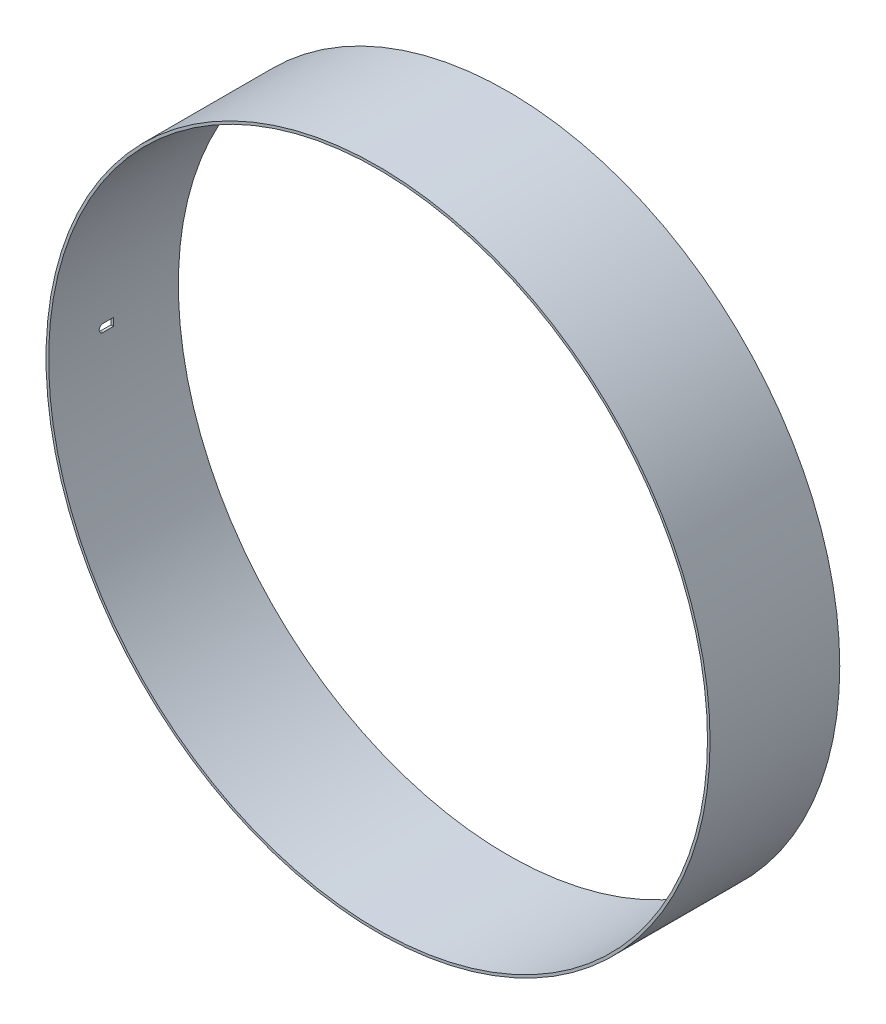
ISO-10303-21;
HEADER;
FILE_DESCRIPTION(('STEP AP214'),'2;1');
FILE_NAME('part.step','',(''),(''),'','','');
FILE_SCHEMA(('AUTOMOTIVE_DESIGN { 1 0 10303 214 1 1 1 1 }'));
ENDSEC;
DATA;
#1=APPLICATION_CONTEXT('core data for automotive mechanical design processes');
#2=APPLICATION_PROTOCOL_DEFINITION('international standard','automotive_design',2000,#1);
#3=PRODUCT_CONTEXT('',#1,'mechanical');
#4=PRODUCT('Part','Part','',(#3));
#5=PRODUCT_RELATED_PRODUCT_CATEGORY('part','',(#4));
#6=PRODUCT_DEFINITION_FORMATION('','',#4);
#7=PRODUCT_DEFINITION_CONTEXT('part definition',#1,'design');
#8=PRODUCT_DEFINITION('design','',#6,#7);
#9=PRODUCT_DEFINITION_SHAPE('','',#8);
#10=(LENGTH_UNIT() NAMED_UNIT(*) SI_UNIT(.MILLI.,.METRE.));
#11=(NAMED_UNIT(*) PLANE_ANGLE_UNIT() SI_UNIT($,.RADIAN.));
#12=(NAMED_UNIT(*) SI_UNIT($,.STERADIAN.) SOLID_ANGLE_UNIT());
#13=UNCERTAINTY_MEASURE_WITH_UNIT(LENGTH_MEASURE(1.E-05),#10,'distance_accuracy_value','');
#14=(GEOMETRIC_REPRESENTATION_CONTEXT(3) GLOBAL_UNCERTAINTY_ASSIGNED_CONTEXT((#13)) GLOBAL_UNIT_ASSIGNED_CONTEXT((#10,
#11,#12)) REPRESENTATION_CONTEXT('',''));
#15=CARTESIAN_POINT('',(0.,0.,0.));
#16=DIRECTION('',(0.,0.,1.));
#17=DIRECTION('',(1.,0.,0.));
#18=AXIS2_PLACEMENT_3D('',#15,#16,#17);
#19=CARTESIAN_POINT('',(0.,0.,25.));
#20=DIRECTION('',(0.,0.,1.));
#21=DIRECTION('',(1.,0.,0.));
#22=AXIS2_PLACEMENT_3D('',#19,#20,#21);
#23=PLANE('',#22);
#24=CARTESIAN_POINT('',(0.,0.,25.));
#25=DIRECTION('',(0.,0.,1.));
#26=DIRECTION('',(1.,0.,0.));
#27=AXIS2_PLACEMENT_3D('',#24,#25,#26);
#28=CIRCLE('',#27,64.);
#29=CARTESIAN_POINT('',(64.,0.,25.));
#30=VERTEX_POINT('',#29);
#31=EDGE_CURVE('E137',#30,#30,#28,.T.);
#32=ORIENTED_EDGE('',*,*,#31,.T.);
#33=EDGE_LOOP('',(#32));
#34=FACE_BOUND('',#33,.T.);
#35=CARTESIAN_POINT('',(0.,0.,25.));
#36=DIRECTION('',(0.,0.,1.));
#37=DIRECTION('',(1.,0.,0.));
#38=AXIS2_PLACEMENT_3D('',#35,#36,#37);
#39=CIRCLE('',#38,63.5);
#40=CARTESIAN_POINT('',(63.5,0.,25.));
#41=VERTEX_POINT('',#40);
#42=EDGE_CURVE('E102',#41,#41,#39,.T.);
#43=ORIENTED_EDGE('',*,*,#42,.F.);
#44=EDGE_LOOP('',(#43));
#45=FACE_BOUND('',#44,.T.);
#46=ADVANCED_FACE('F36',(#34,#45),#23,.T.);
#47=CARTESIAN_POINT('',(0.,0.,0.));
#48=DIRECTION('',(0.,0.,1.));
#49=DIRECTION('',(1.,0.,0.));
#50=AXIS2_PLACEMENT_3D('',#47,#48,#49);
#51=PLANE('',#50);
#52=CARTESIAN_POINT('',(0.,0.,0.));
#53=DIRECTION('',(0.,0.,1.));
#54=DIRECTION('',(1.,0.,0.));
#55=AXIS2_PLACEMENT_3D('',#52,#53,#54);
#56=CIRCLE('',#55,64.);
#57=CARTESIAN_POINT('',(64.,0.,0.));
#58=VERTEX_POINT('',#57);
#59=EDGE_CURVE('E133',#58,#58,#56,.T.);
#60=ORIENTED_EDGE('',*,*,#59,.F.);
#61=EDGE_LOOP('',(#60));
#62=FACE_BOUND('',#61,.T.);
#63=CARTESIAN_POINT('',(0.,0.,0.));
#64=DIRECTION('',(0.,0.,1.));
#65=DIRECTION('',(1.,0.,0.));
#66=AXIS2_PLACEMENT_3D('',#63,#64,#65);
#67=CIRCLE('',#66,63.5);
#68=CARTESIAN_POINT('',(63.5,0.,0.));
#69=VERTEX_POINT('',#68);
#70=EDGE_CURVE('E99',#69,#69,#67,.T.);
#71=ORIENTED_EDGE('',*,*,#70,.T.);
#72=EDGE_LOOP('',(#71));
#73=FACE_BOUND('',#72,.T.);
#74=ADVANCED_FACE('F123',(#62,#73),#51,.F.);
#75=CARTESIAN_POINT('',(0.,0.,25.));
#76=DIRECTION('',(0.,0.,-1.));
#77=DIRECTION('',(-1.,0.,0.));
#78=AXIS2_PLACEMENT_3D('',#75,#76,#77);
#79=CYLINDRICAL_SURFACE('',#78,64.);
#80=DIRECTION('',(0.,0.,-1.));
#81=VECTOR('',#80,1.);
#82=CARTESIAN_POINT('',(-63.9956053178654,0.749999999999997,25.));
#83=LINE('',#82,#81);
#84=CARTESIAN_POINT('',(-63.9956053178654,0.749999999999999,12.5));
#85=VERTEX_POINT('',#84);
#86=CARTESIAN_POINT('',(-63.9956053178654,0.749999999999999,14.5));
#87=VERTEX_POINT('',#86);
#88=EDGE_CURVE('E98',#85,#87,#83,.F.);
#89=ORIENTED_EDGE('',*,*,#88,.T.);
#90=CARTESIAN_POINT('',(-63.9956053178654,0.749999999999999,14.5));
#91=CARTESIAN_POINT('',(-63.9956037098696,0.750035835942117,14.5421910770075));
#92=CARTESIAN_POINT('',(-63.9956469970787,0.746441968559594,14.5843714215498));
#93=CARTESIAN_POINT('',(-63.9958114826796,0.732258948323395,14.6675087499764));
#94=CARTESIAN_POINT('',(-63.9959326238419,0.721674933697341,14.7084666093731));
#95=CARTESIAN_POINT('',(-63.9962410418769,0.693768570284752,14.788040884003));
#96=CARTESIAN_POINT('',(-63.996428349344,0.676443103974629,14.8266562063873));
#97=CARTESIAN_POINT('',(-63.9968474288403,0.635561316466206,14.9004231573654));
#98=CARTESIAN_POINT('',(-63.9970791921771,0.612006213004127,14.9355754610504));
#99=CARTESIAN_POINT('',(-63.9975612337378,0.559327317799181,15.0014292132468));
#100=CARTESIAN_POINT('',(-63.9978115131609,0.530203165186916,15.0321303731013));
#101=CARTESIAN_POINT('',(-63.9983023641379,0.467209642594577,15.088212293629));
#102=CARTESIAN_POINT('',(-63.9985429342075,0.43333955065406,15.1135922433615));
#103=CARTESIAN_POINT('',(-63.9989872076672,0.361819288781405,15.1583049301819));
#104=CARTESIAN_POINT('',(-63.9991909116235,0.324169176929307,15.1776377601651));
#105=CARTESIAN_POINT('',(-63.9995384760734,0.246159794660724,15.2097067767733));
#106=CARTESIAN_POINT('',(-63.999682340412,0.205800698501665,15.2224433872466));
#107=CARTESIAN_POINT('',(-63.9998940231178,0.123517926763101,15.2409599211599));
#108=CARTESIAN_POINT('',(-63.9999618434687,0.0815942920255288,15.2467400260672));
#109=CARTESIAN_POINT('',(-64.0000137992556,-0.00262935043937894,15.2511800445644));
#110=CARTESIAN_POINT('',(-63.9999979327951,-0.0449293666746839,15.249839796791));
#111=CARTESIAN_POINT('',(-63.999884302904,-0.128701411472135,15.240077097833));
#112=CARTESIAN_POINT('',(-63.9997865443094,-0.17017348877856,15.2316550648495));
#113=CARTESIAN_POINT('',(-63.9995201572991,-0.251114901443764,15.2079685291027));
#114=CARTESIAN_POINT('',(-63.9993515290966,-0.290584242826735,15.1927040469227));
#115=CARTESIAN_POINT('',(-63.9989624013025,-0.366402039513268,15.1557650942976));
#116=CARTESIAN_POINT('',(-63.9987418990573,-0.402750335032307,15.1340902959234));
#117=CARTESIAN_POINT('',(-63.9982738968681,-0.471290475760222,15.0849473003297));
#118=CARTESIAN_POINT('',(-63.9980263982414,-0.503482523632332,15.0574793857612));
#119=CARTESIAN_POINT('',(-63.9975323102206,-0.562796477535366,14.997532032022));
#120=CARTESIAN_POINT('',(-63.9972857207604,-0.589918759154415,14.9650529644228));
#121=CARTESIAN_POINT('',(-63.9968211526899,-0.638334337428008,14.8959896190705));
#122=CARTESIAN_POINT('',(-63.9966031831936,-0.659625779586504,14.8594040404471));
#123=CARTESIAN_POINT('',(-63.9962204079976,-0.695774218932545,14.7831617899206));
#124=CARTESIAN_POINT('',(-63.9960556347582,-0.710627289322739,14.7435032611389));
#125=CARTESIAN_POINT('',(-63.9957982663388,-0.733441606037515,14.6622861412113));
#126=CARTESIAN_POINT('',(-63.9957055609467,-0.741413377877501,14.6207305546609));
#127=CARTESIAN_POINT('',(-63.9956377315346,-0.747229465587877,14.565748912583));
#128=CARTESIAN_POINT('',(-63.9956255825901,-0.748268964520423,14.5526090631731));
#129=CARTESIAN_POINT('',(-63.9956093866077,-0.749653283235331,14.5263145831028));
#130=CARTESIAN_POINT('',(-63.995605326207,-0.749999248782374,14.5131600128046));
#131=CARTESIAN_POINT('',(-63.9956053178654,-0.750000000000001,14.5));
#132=B_SPLINE_CURVE_WITH_KNOTS('',3,(#90,#91,#92,#93,#94,#95,#96,#97,#98,#99,#100,#101,#102,
#103,#104,#105,#106,#107,#108,#109,#110,#111,#112,#113,#114,#115,#116,#117,#118,#119,#120,#121,
#122,#123,#124,#125,#126,#127,#128,#129,#130,#131),.UNSPECIFIED.,.F.,.F.,(4,2,2,2,2,2,2,2,2,2,2,
2,2,2,2,2,2,2,2,2,4),(0.,0.126405040814938,0.252717268697454,0.379087978085643,
0.505434003436502,0.631788218672794,0.758161676038905,0.884533191972769,1.010896586741,
1.13725668512515,1.2636196471274,1.38997514753461,1.5163302678443,1.64269185315666,
1.76904727460939,1.89539333144472,2.02177952604463,2.14824269617108,2.27451208590352,
2.31404205419671,2.3535066622743),.UNSPECIFIED.);
#133=CARTESIAN_POINT('',(-63.9956053178654,-0.750000000000001,14.5));
#134=VERTEX_POINT('',#133);
#135=EDGE_CURVE('E91',#87,#134,#132,.T.);
#136=ORIENTED_EDGE('',*,*,#135,.T.);
#137=DIRECTION('',(0.,0.,-1.));
#138=VECTOR('',#137,1.);
#139=CARTESIAN_POINT('',(-63.9956053178654,-0.750000000000001,25.));
#140=LINE('',#139,#138);
#141=CARTESIAN_POINT('',(-63.9956053178654,-0.750000000000001,12.5));
#142=VERTEX_POINT('',#141);
#143=EDGE_CURVE('E80',#134,#142,#140,.T.);
#144=ORIENTED_EDGE('',*,*,#143,.T.);
#145=CARTESIAN_POINT('',(0.,0.,12.5));
#146=DIRECTION('',(0.,0.,-1.));
#147=DIRECTION('',(-1.,0.,0.));
#148=AXIS2_PLACEMENT_3D('',#145,#146,#147);
#149=CIRCLE('',#148,64.);
#150=EDGE_CURVE('E85',#142,#85,#149,.T.);
#151=ORIENTED_EDGE('',*,*,#150,.T.);
#152=EDGE_LOOP('',(#89,#136,#144,#151));
#153=FACE_BOUND('',#152,.T.);
#154=ORIENTED_EDGE('',*,*,#31,.F.);
#155=EDGE_LOOP('',(#154));
#156=FACE_BOUND('',#155,.T.);
#157=ORIENTED_EDGE('',*,*,#59,.T.);
#158=EDGE_LOOP('',(#157));
#159=FACE_BOUND('',#158,.T.);
#160=ADVANCED_FACE('F38',(#153,#156,#159),#79,.T.);
#161=CARTESIAN_POINT('',(0.,0.,25.));
#162=DIRECTION('',(0.,0.,-1.));
#163=DIRECTION('',(-1.,0.,0.));
#164=AXIS2_PLACEMENT_3D('',#161,#162,#163);
#165=CYLINDRICAL_SURFACE('',#164,63.5);
#166=CARTESIAN_POINT('',(-63.4955707116646,0.749999999999999,14.5));
#167=CARTESIAN_POINT('',(-63.4955690910058,0.750035836051837,14.5421910528964));
#168=CARTESIAN_POINT('',(-63.4956127190584,0.746441972648091,14.5843713728113));
#169=CARTESIAN_POINT('',(-63.4957784997986,0.732258969571632,14.6675086499747));
#170=CARTESIAN_POINT('',(-63.4959005948023,0.72167496843853,14.70846648279));
#171=CARTESIAN_POINT('',(-63.4962114412277,0.693768642903057,14.7880407045254));
#172=CARTESIAN_POINT('',(-63.4964002234832,0.676443201109353,14.8266560006418));
#173=CARTESIAN_POINT('',(-63.4968226026323,0.635561473481933,14.9004229044998));
#174=CARTESIAN_POINT('',(-63.4970561907656,0.612006405279076,14.9355751872745));
#175=CARTESIAN_POINT('',(-63.4975420278759,0.559327571612713,15.0014289293752));
#176=CARTESIAN_POINT('',(-63.497794278074,0.530203441516458,15.0321300970341));
#177=CARTESIAN_POINT('',(-63.4982889942095,0.467209962645887,15.0882120387531));
#178=CARTESIAN_POINT('',(-63.498531458651,0.433339891911354,15.1135920018738));
#179=CARTESIAN_POINT('',(-63.4989792307359,0.361819651276852,15.1583047317004));
#180=CARTESIAN_POINT('',(-63.4991845389332,0.324169537736414,15.1776375885496));
#181=CARTESIAN_POINT('',(-63.4995348406571,0.246160143040499,15.2097066568461));
#182=CARTESIAN_POINT('',(-63.4996798380592,0.205801036155082,15.2224432921711));
#183=CARTESIAN_POINT('',(-63.4998931879846,0.123518265762748,15.2409598639638));
#184=CARTESIAN_POINT('',(-63.4999615425637,0.0815946442507954,15.2467399870212));
#185=CARTESIAN_POINT('',(-63.500013907919,-0.00262897574486348,15.2511800452897));
#186=CARTESIAN_POINT('',(-63.4999979167843,-0.0449289827346218,15.2498398191758));
#187=CARTESIAN_POINT('',(-63.4998833927526,-0.128700978670359,15.2400771706288));
#188=CARTESIAN_POINT('',(-63.4997848647938,-0.170173017001715,15.231655171898));
#189=CARTESIAN_POINT('',(-63.4995163811118,-0.251114357473526,15.2079687192999));
#190=CARTESIAN_POINT('',(-63.4993464256033,-0.290583665632958,15.1927042859983));
#191=CARTESIAN_POINT('',(-63.4989542346685,-0.366401420476897,15.1557654380355));
#192=CARTESIAN_POINT('',(-63.4987319965471,-0.402749706145881,15.1340906929183));
#193=CARTESIAN_POINT('',(-63.498260309867,-0.471289838672228,15.084947811028));
#194=CARTESIAN_POINT('',(-63.498010862636,-0.503481888161457,15.0574799568623));
#195=CARTESIAN_POINT('',(-63.4975128840776,-0.562795888771725,14.997532698229));
#196=CARTESIAN_POINT('',(-63.4972643526845,-0.589918210657787,14.9650536605622));
#197=CARTESIAN_POINT('',(-63.4967961258135,-0.638333874649517,14.8959903654849));
#198=CARTESIAN_POINT('',(-63.4965764395211,-0.659625362280235,14.8594048072147));
#199=CARTESIAN_POINT('',(-63.4961906492086,-0.695773896029865,14.7831625845149));
#200=CARTESIAN_POINT('',(-63.4960245779054,-0.710627015227256,14.7435040631396));
#201=CARTESIAN_POINT('',(-63.495765181683,-0.733441428721143,14.6622869456311));
#202=CARTESIAN_POINT('',(-63.4956717456842,-0.741413248509775,14.6207313541052));
#203=CARTESIAN_POINT('',(-63.4956033812504,-0.747229409924364,14.5657495718904));
#204=CARTESIAN_POINT('',(-63.4955911363863,-0.748268929735418,14.552609591173));
#205=CARTESIAN_POINT('',(-63.4955748125311,-0.749653276264788,14.5263148475938));
#206=CARTESIAN_POINT('',(-63.4955707200717,-0.749999248774339,14.5131601450964));
#207=CARTESIAN_POINT('',(-63.4955707116646,-0.750000000000001,14.5));
#208=B_SPLINE_CURVE_WITH_KNOTS('',3,(#166,#167,#168,#169,#170,#171,#172,#173,#174,#175,#176,
#177,#178,#179,#180,#181,#182,#183,#184,#185,#186,#187,#188,#189,#190,#191,#192,#193,#194,#195,
#196,#197,#198,#199,#200,#201,#202,#203,#204,#205,#206,#207),.UNSPECIFIED.,.F.,.F.,(4,2,2,2,2,2,
2,2,2,2,2,2,2,2,2,2,2,2,2,2,4),(0.,0.126404967550325,0.252717116466589,0.379087744463783,
0.505433690531176,0.631787911897898,0.758161375384008,0.884532954951809,1.0108964127886,
1.13725648119248,1.2636194125366,1.38997478412779,1.51632977594989,1.64269128259404,
1.76904662631971,1.89539272566569,2.02177896236933,2.14824217709524,2.27451161181013,
2.31404197750779,2.35350698212947),.UNSPECIFIED.);
#209=CARTESIAN_POINT('',(-63.4955707116647,0.749999999999999,14.5));
#210=VERTEX_POINT('',#209);
#211=CARTESIAN_POINT('',(-63.4955707116646,-0.750000000000001,14.5));
#212=VERTEX_POINT('',#211);
#213=EDGE_CURVE('E11',#210,#212,#208,.T.);
#214=ORIENTED_EDGE('',*,*,#213,.F.);
#215=DIRECTION('',(0.,0.,-1.));
#216=VECTOR('',#215,1.);
#217=CARTESIAN_POINT('',(-63.4955707116646,0.749999999999997,25.));
#218=LINE('',#217,#216);
#219=CARTESIAN_POINT('',(-63.4955707116646,0.749999999999999,12.5));
#220=VERTEX_POINT('',#219);
#221=EDGE_CURVE('E51',#220,#210,#218,.F.);
#222=ORIENTED_EDGE('',*,*,#221,.F.);
#223=CARTESIAN_POINT('',(0.,0.,12.5));
#224=DIRECTION('',(0.,0.,-1.));
#225=DIRECTION('',(-1.,0.,0.));
#226=AXIS2_PLACEMENT_3D('',#223,#224,#225);
#227=CIRCLE('',#226,63.5);
#228=CARTESIAN_POINT('',(-63.4955707116647,-0.750000000000001,12.5));
#229=VERTEX_POINT('',#228);
#230=EDGE_CURVE('E145',#229,#220,#227,.T.);
#231=ORIENTED_EDGE('',*,*,#230,.F.);
#232=DIRECTION('',(0.,0.,-1.));
#233=VECTOR('',#232,1.);
#234=CARTESIAN_POINT('',(-63.4955707116646,-0.750000000000001,25.));
#235=LINE('',#234,#233);
#236=EDGE_CURVE('E140',#212,#229,#235,.T.);
#237=ORIENTED_EDGE('',*,*,#236,.F.);
#238=EDGE_LOOP('',(#214,#222,#231,#237));
#239=FACE_BOUND('',#238,.T.);
#240=ORIENTED_EDGE('',*,*,#42,.T.);
#241=EDGE_LOOP('',(#240));
#242=FACE_BOUND('',#241,.T.);
#243=ORIENTED_EDGE('',*,*,#70,.F.);
#244=EDGE_LOOP('',(#243));
#245=FACE_BOUND('',#244,.T.);
#246=ADVANCED_FACE('F115',(#239,#242,#245),#165,.F.);
#247=CARTESIAN_POINT('',(-2000.,0.,14.5));
#248=DIRECTION('',(1.,0.,0.));
#249=DIRECTION('',(0.,0.,-1.));
#250=AXIS2_PLACEMENT_3D('',#247,#248,#249);
#251=CYLINDRICAL_SURFACE('',#250,0.75);
#252=DIRECTION('',(1.,0.,0.));
#253=VECTOR('',#252,1.);
#254=CARTESIAN_POINT('',(-2000.,0.749999999999999,14.5));
#255=LINE('',#254,#253);
#256=EDGE_CURVE('E86',#87,#210,#255,.T.);
#257=ORIENTED_EDGE('',*,*,#256,.T.);
#258=ORIENTED_EDGE('',*,*,#213,.T.);
#259=DIRECTION('',(1.,0.,0.));
#260=VECTOR('',#259,1.);
#261=CARTESIAN_POINT('',(-2000.,-0.750000000000001,14.5));
#262=LINE('',#261,#260);
#263=EDGE_CURVE('E63',#134,#212,#262,.T.);
#264=ORIENTED_EDGE('',*,*,#263,.F.);
#265=ORIENTED_EDGE('',*,*,#135,.F.);
#266=EDGE_LOOP('',(#257,#258,#264,#265));
#267=FACE_BOUND('',#266,.T.);
#268=ADVANCED_FACE('F90',(#267),#251,.F.);
#269=CARTESIAN_POINT('',(-2000.,0.749999999999999,12.5));
#270=DIRECTION('',(0.,1.,0.));
#271=DIRECTION('',(0.,0.,1.));
#272=AXIS2_PLACEMENT_3D('',#269,#270,#271);
#273=PLANE('',#272);
#274=DIRECTION('',(1.,0.,0.));
#275=VECTOR('',#274,1.);
#276=CARTESIAN_POINT('',(-2000.,0.749999999999999,12.5));
#277=LINE('',#276,#275);
#278=EDGE_CURVE('E150',#85,#220,#277,.T.);
#279=ORIENTED_EDGE('',*,*,#278,.T.);
#280=ORIENTED_EDGE('',*,*,#221,.T.);
#281=ORIENTED_EDGE('',*,*,#256,.F.);
#282=ORIENTED_EDGE('',*,*,#88,.F.);
#283=EDGE_LOOP('',(#279,#280,#281,#282));
#284=FACE_BOUND('',#283,.T.);
#285=ADVANCED_FACE('F114',(#284),#273,.F.);
#286=CARTESIAN_POINT('',(-2000.,-0.750000000000001,12.5));
#287=DIRECTION('',(0.,0.,-1.));
#288=DIRECTION('',(-1.,0.,0.));
#289=AXIS2_PLACEMENT_3D('',#286,#287,#288);
#290=PLANE('',#289);
#291=DIRECTION('',(1.,0.,0.));
#292=VECTOR('',#291,1.);
#293=CARTESIAN_POINT('',(-2000.,-0.750000000000001,12.5));
#294=LINE('',#293,#292);
#295=EDGE_CURVE('E58',#142,#229,#294,.T.);
#296=ORIENTED_EDGE('',*,*,#295,.T.);
#297=ORIENTED_EDGE('',*,*,#230,.T.);
#298=ORIENTED_EDGE('',*,*,#278,.F.);
#299=ORIENTED_EDGE('',*,*,#150,.F.);
#300=EDGE_LOOP('',(#296,#297,#298,#299));
#301=FACE_BOUND('',#300,.T.);
#302=ADVANCED_FACE('F155',(#301),#290,.F.);
#303=CARTESIAN_POINT('',(-2000.,-0.750000000000001,14.5));
#304=DIRECTION('',(0.,-1.,0.));
#305=DIRECTION('',(0.,0.,-1.));
#306=AXIS2_PLACEMENT_3D('',#303,#304,#305);
#307=PLANE('',#306);
#308=ORIENTED_EDGE('',*,*,#263,.T.);
#309=ORIENTED_EDGE('',*,*,#236,.T.);
#310=ORIENTED_EDGE('',*,*,#295,.F.);
#311=ORIENTED_EDGE('',*,*,#143,.F.);
#312=EDGE_LOOP('',(#308,#309,#310,#311));
#313=FACE_BOUND('',#312,.T.);
#314=ADVANCED_FACE('F81',(#313),#307,.F.);
#315=CLOSED_SHELL('',(#46,#74,#160,#246,#268,#285,#302,#314));
#316=MANIFOLD_SOLID_BREP('B2',#315);
#317=ADVANCED_BREP_SHAPE_REPRESENTATION('',(#18,#316),#14);
#318=SHAPE_DEFINITION_REPRESENTATION(#9,#317);
ENDSEC;
END-ISO-10303-21;
